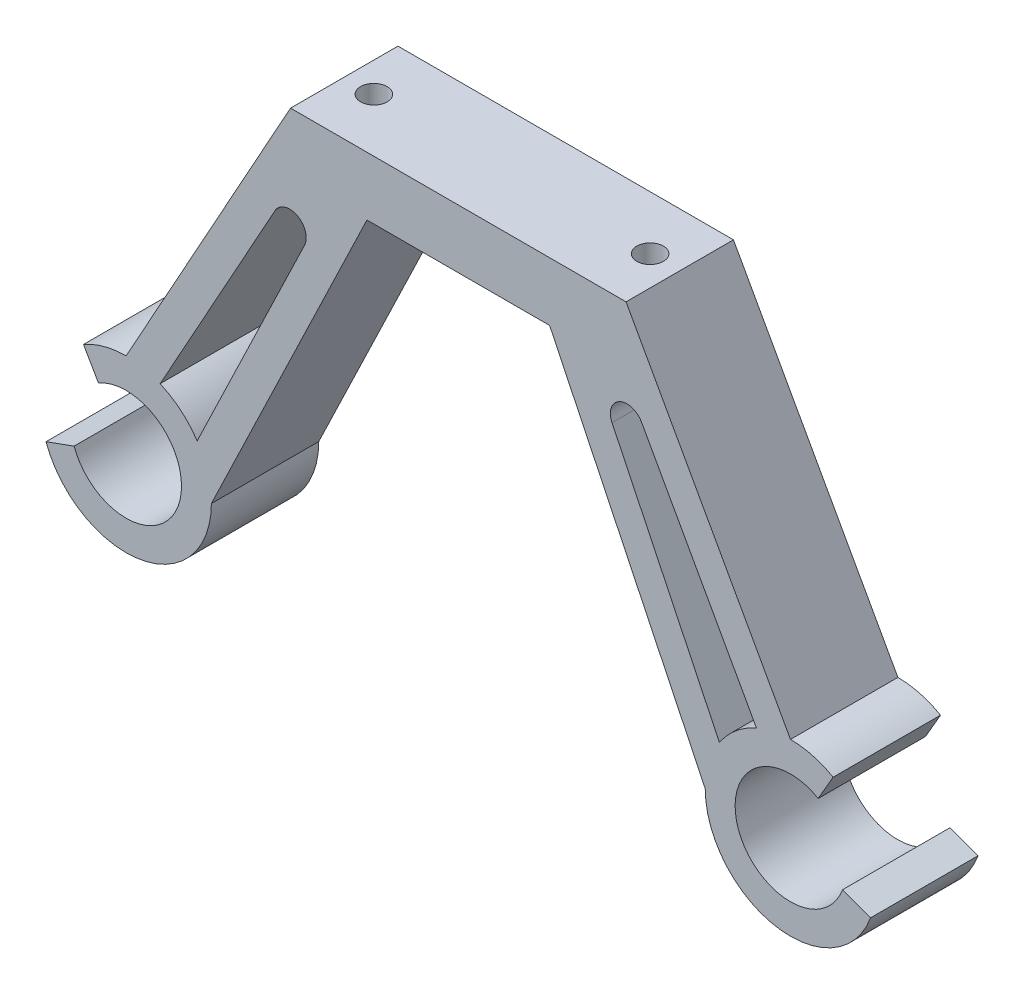
ISO-10303-21;
HEADER;
FILE_DESCRIPTION(('STEP AP214'),'2;1');
FILE_NAME('part.step','',(''),(''),'','','');
FILE_SCHEMA(('AUTOMOTIVE_DESIGN { 1 0 10303 214 1 1 1 1 }'));
ENDSEC;
DATA;
#1=APPLICATION_CONTEXT('core data for automotive mechanical design processes');
#2=APPLICATION_PROTOCOL_DEFINITION('international standard','automotive_design',2000,#1);
#3=PRODUCT_CONTEXT('',#1,'mechanical');
#4=PRODUCT('Part','Part','',(#3));
#5=PRODUCT_RELATED_PRODUCT_CATEGORY('part','',(#4));
#6=PRODUCT_DEFINITION_FORMATION('','',#4);
#7=PRODUCT_DEFINITION_CONTEXT('part definition',#1,'design');
#8=PRODUCT_DEFINITION('design','',#6,#7);
#9=PRODUCT_DEFINITION_SHAPE('','',#8);
#10=(LENGTH_UNIT() NAMED_UNIT(*) SI_UNIT(.MILLI.,.METRE.));
#11=(NAMED_UNIT(*) PLANE_ANGLE_UNIT() SI_UNIT($,.RADIAN.));
#12=(NAMED_UNIT(*) SI_UNIT($,.STERADIAN.) SOLID_ANGLE_UNIT());
#13=UNCERTAINTY_MEASURE_WITH_UNIT(LENGTH_MEASURE(1.E-05),#10,'distance_accuracy_value','');
#14=(GEOMETRIC_REPRESENTATION_CONTEXT(3) GLOBAL_UNCERTAINTY_ASSIGNED_CONTEXT((#13)) GLOBAL_UNIT_ASSIGNED_CONTEXT((#10,
#11,#12)) REPRESENTATION_CONTEXT('',''));
#15=CARTESIAN_POINT('',(0.,0.,0.));
#16=DIRECTION('',(0.,0.,1.));
#17=DIRECTION('',(1.,0.,0.));
#18=AXIS2_PLACEMENT_3D('',#15,#16,#17);
#19=CARTESIAN_POINT('',(-15.15,19.9,4.85));
#20=DIRECTION('',(0.874695571220269,-0.484672732560485,0.));
#21=DIRECTION('',(0.484672732560485,0.874695571220269,0.));
#22=AXIS2_PLACEMENT_3D('',#19,#20,#21);
#23=PLANE('',#22);
#24=DIRECTION('',(-0.484672732560485,-0.874695571220269,0.));
#25=VECTOR('',#24,1.);
#26=CARTESIAN_POINT('',(-15.15,19.9,-4.85));
#27=LINE('',#26,#25);
#28=CARTESIAN_POINT('',(-15.15,19.9,-4.85));
#29=VERTEX_POINT('',#28);
#30=CARTESIAN_POINT('',(-30.,-6.9,-4.85));
#31=VERTEX_POINT('',#30);
#32=EDGE_CURVE('E237',#29,#31,#27,.T.);
#33=ORIENTED_EDGE('',*,*,#32,.T.);
#34=DIRECTION('',(0.,0.,-1.));
#35=VECTOR('',#34,1.);
#36=CARTESIAN_POINT('',(-30.,-6.9,4.85));
#37=LINE('',#36,#35);
#38=CARTESIAN_POINT('',(-30.,-6.9,4.85));
#39=VERTEX_POINT('',#38);
#40=EDGE_CURVE('E11',#39,#31,#37,.T.);
#41=ORIENTED_EDGE('',*,*,#40,.F.);
#42=DIRECTION('',(-0.484672732560485,-0.874695571220269,0.));
#43=VECTOR('',#42,1.);
#44=CARTESIAN_POINT('',(-15.15,19.9,4.85));
#45=LINE('',#44,#43);
#46=CARTESIAN_POINT('',(-15.15,19.9,4.85));
#47=VERTEX_POINT('',#46);
#48=EDGE_CURVE('E271',#47,#39,#45,.T.);
#49=ORIENTED_EDGE('',*,*,#48,.F.);
#50=DIRECTION('',(0.,0.,-1.));
#51=VECTOR('',#50,1.);
#52=CARTESIAN_POINT('',(-15.15,19.9,4.85));
#53=LINE('',#52,#51);
#54=EDGE_CURVE('E305',#47,#29,#53,.T.);
#55=ORIENTED_EDGE('',*,*,#54,.T.);
#56=EDGE_LOOP('',(#33,#41,#49,#55));
#57=FACE_BOUND('',#56,.T.);
#58=ADVANCED_FACE('F39',(#57),#23,.F.);
#59=CARTESIAN_POINT('',(-30.,-14.6,4.85));
#60=DIRECTION('',(0.,0.,-1.));
#61=DIRECTION('',(-1.,0.,0.));
#62=AXIS2_PLACEMENT_3D('',#59,#60,#61);
#63=CYLINDRICAL_SURFACE('',#62,7.7);
#64=CARTESIAN_POINT('',(-30.,-14.6,-4.85));
#65=DIRECTION('',(0.,0.,1.));
#66=DIRECTION('',(1.,0.,0.));
#67=AXIS2_PLACEMENT_3D('',#64,#65,#66);
#68=CIRCLE('',#67,7.7);
#69=CARTESIAN_POINT('',(-33.85,-7.93160439085982,-4.85));
#70=VERTEX_POINT('',#69);
#71=EDGE_CURVE('E308',#31,#70,#68,.T.);
#72=ORIENTED_EDGE('',*,*,#71,.T.);
#73=DIRECTION('',(0.,0.,-1.));
#74=VECTOR('',#73,1.);
#75=CARTESIAN_POINT('',(-33.85,-7.93160439085982,4.85));
#76=LINE('',#75,#74);
#77=CARTESIAN_POINT('',(-33.85,-7.93160439085982,4.85));
#78=VERTEX_POINT('',#77);
#79=EDGE_CURVE('E46',#78,#70,#76,.T.);
#80=ORIENTED_EDGE('',*,*,#79,.F.);
#81=CARTESIAN_POINT('',(-30.,-14.6,4.85));
#82=DIRECTION('',(0.,0.,1.));
#83=DIRECTION('',(1.,0.,0.));
#84=AXIS2_PLACEMENT_3D('',#81,#82,#83);
#85=CIRCLE('',#84,7.7);
#86=EDGE_CURVE('E274',#39,#78,#85,.T.);
#87=ORIENTED_EDGE('',*,*,#86,.F.);
#88=ORIENTED_EDGE('',*,*,#40,.T.);
#89=EDGE_LOOP('',(#72,#80,#87,#88));
#90=FACE_BOUND('',#89,.T.);
#91=ADVANCED_FACE('F404',(#90),#63,.T.);
#92=CARTESIAN_POINT('',(-33.85,-7.93160439085982,4.85));
#93=DIRECTION('',(0.866025403784441,0.499999999999996,0.));
#94=DIRECTION('',(-0.499999999999996,0.866025403784441,0.));
#95=AXIS2_PLACEMENT_3D('',#92,#93,#94);
#96=PLANE('',#95);
#97=DIRECTION('',(0.499999999999996,-0.866025403784441,0.));
#98=VECTOR('',#97,1.);
#99=CARTESIAN_POINT('',(-33.85,-7.93160439085982,-4.85));
#100=LINE('',#99,#98);
#101=CARTESIAN_POINT('',(-32.5,-10.2698729810778,-4.85));
#102=VERTEX_POINT('',#101);
#103=EDGE_CURVE('E310',#70,#102,#100,.T.);
#104=ORIENTED_EDGE('',*,*,#103,.T.);
#105=DIRECTION('',(0.,0.,-1.));
#106=VECTOR('',#105,1.);
#107=CARTESIAN_POINT('',(-32.5,-10.2698729810778,4.85));
#108=LINE('',#107,#106);
#109=CARTESIAN_POINT('',(-32.5,-10.2698729810778,4.85));
#110=VERTEX_POINT('',#109);
#111=EDGE_CURVE('E375',#110,#102,#108,.T.);
#112=ORIENTED_EDGE('',*,*,#111,.F.);
#113=DIRECTION('',(0.499999999999996,-0.866025403784441,0.));
#114=VECTOR('',#113,1.);
#115=CARTESIAN_POINT('',(-33.85,-7.93160439085982,4.85));
#116=LINE('',#115,#114);
#117=EDGE_CURVE('E277',#78,#110,#116,.T.);
#118=ORIENTED_EDGE('',*,*,#117,.F.);
#119=ORIENTED_EDGE('',*,*,#79,.T.);
#120=EDGE_LOOP('',(#104,#112,#118,#119));
#121=FACE_BOUND('',#120,.T.);
#122=ADVANCED_FACE('F382',(#121),#96,.F.);
#123=CARTESIAN_POINT('',(-30.,-14.6,4.85));
#124=DIRECTION('',(0.,0.,-1.));
#125=DIRECTION('',(-1.,0.,0.));
#126=AXIS2_PLACEMENT_3D('',#123,#124,#125);
#127=CYLINDRICAL_SURFACE('',#126,5.);
#128=CARTESIAN_POINT('',(-30.,-14.6,-4.85));
#129=DIRECTION('',(0.,0.,-1.));
#130=DIRECTION('',(1.,0.,0.));
#131=AXIS2_PLACEMENT_3D('',#128,#129,#130);
#132=CIRCLE('',#131,5.);
#133=CARTESIAN_POINT('',(-34.6984631039295,-16.3101007166283,-4.85));
#134=VERTEX_POINT('',#133);
#135=EDGE_CURVE('E312',#102,#134,#132,.T.);
#136=ORIENTED_EDGE('',*,*,#135,.T.);
#137=DIRECTION('',(0.,0.,-1.));
#138=VECTOR('',#137,1.);
#139=CARTESIAN_POINT('',(-34.6984631039295,-16.3101007166283,4.85));
#140=LINE('',#139,#138);
#141=CARTESIAN_POINT('',(-34.6984631039295,-16.3101007166283,4.85));
#142=VERTEX_POINT('',#141);
#143=EDGE_CURVE('E372',#142,#134,#140,.T.);
#144=ORIENTED_EDGE('',*,*,#143,.F.);
#145=CARTESIAN_POINT('',(-30.,-14.6,4.85));
#146=DIRECTION('',(0.,0.,-1.));
#147=DIRECTION('',(1.,0.,0.));
#148=AXIS2_PLACEMENT_3D('',#145,#146,#147);
#149=CIRCLE('',#148,5.);
#150=EDGE_CURVE('E279',#110,#142,#149,.T.);
#151=ORIENTED_EDGE('',*,*,#150,.F.);
#152=ORIENTED_EDGE('',*,*,#111,.T.);
#153=EDGE_LOOP('',(#136,#144,#151,#152));
#154=FACE_BOUND('',#153,.T.);
#155=ADVANCED_FACE('F393',(#154),#127,.F.);
#156=CARTESIAN_POINT('',(-34.6984631039295,-16.3101007166283,4.85));
#157=DIRECTION('',(0.342020143325663,-0.93969262078591,0.));
#158=DIRECTION('',(0.939692620785911,0.342020143325663,0.));
#159=AXIS2_PLACEMENT_3D('',#156,#157,#158);
#160=PLANE('',#159);
#161=DIRECTION('',(-0.93969262078591,-0.342020143325663,0.));
#162=VECTOR('',#161,1.);
#163=CARTESIAN_POINT('',(-34.6984631039295,-16.3101007166283,-4.85));
#164=LINE('',#163,#162);
#165=CARTESIAN_POINT('',(-37.2356331800515,-17.2335551036076,-4.85));
#166=VERTEX_POINT('',#165);
#167=EDGE_CURVE('E314',#134,#166,#164,.T.);
#168=ORIENTED_EDGE('',*,*,#167,.T.);
#169=DIRECTION('',(0.,0.,-1.));
#170=VECTOR('',#169,1.);
#171=CARTESIAN_POINT('',(-37.2356331800515,-17.2335551036076,4.85));
#172=LINE('',#171,#170);
#173=CARTESIAN_POINT('',(-37.2356331800515,-17.2335551036076,4.85));
#174=VERTEX_POINT('',#173);
#175=EDGE_CURVE('E369',#174,#166,#172,.T.);
#176=ORIENTED_EDGE('',*,*,#175,.F.);
#177=DIRECTION('',(-0.93969262078591,-0.342020143325663,0.));
#178=VECTOR('',#177,1.);
#179=CARTESIAN_POINT('',(-34.6984631039295,-16.3101007166283,4.85));
#180=LINE('',#179,#178);
#181=EDGE_CURVE('E281',#142,#174,#180,.T.);
#182=ORIENTED_EDGE('',*,*,#181,.F.);
#183=ORIENTED_EDGE('',*,*,#143,.T.);
#184=EDGE_LOOP('',(#168,#176,#182,#183));
#185=FACE_BOUND('',#184,.T.);
#186=ADVANCED_FACE('F397',(#185),#160,.F.);
#187=CARTESIAN_POINT('',(-30.,-14.6,4.85));
#188=DIRECTION('',(0.,0.,-1.));
#189=DIRECTION('',(-1.,0.,0.));
#190=AXIS2_PLACEMENT_3D('',#187,#188,#189);
#191=CYLINDRICAL_SURFACE('',#190,7.7);
#192=CARTESIAN_POINT('',(-30.,-14.6,-4.85));
#193=DIRECTION('',(0.,0.,1.));
#194=DIRECTION('',(1.,0.,0.));
#195=AXIS2_PLACEMENT_3D('',#192,#193,#194);
#196=CIRCLE('',#195,7.7);
#197=CARTESIAN_POINT('',(-22.3,-14.6,-4.85));
#198=VERTEX_POINT('',#197);
#199=EDGE_CURVE('E316',#166,#198,#196,.T.);
#200=ORIENTED_EDGE('',*,*,#199,.T.);
#201=DIRECTION('',(0.,0.,-1.));
#202=VECTOR('',#201,1.);
#203=CARTESIAN_POINT('',(-22.3,-14.6,4.85));
#204=LINE('',#203,#202);
#205=CARTESIAN_POINT('',(-22.3,-14.6,4.85));
#206=VERTEX_POINT('',#205);
#207=EDGE_CURVE('E366',#206,#198,#204,.T.);
#208=ORIENTED_EDGE('',*,*,#207,.F.);
#209=CARTESIAN_POINT('',(-30.,-14.6,4.85));
#210=DIRECTION('',(0.,0.,1.));
#211=DIRECTION('',(1.,0.,0.));
#212=AXIS2_PLACEMENT_3D('',#209,#210,#211);
#213=CIRCLE('',#212,7.7);
#214=EDGE_CURVE('E283',#174,#206,#213,.T.);
#215=ORIENTED_EDGE('',*,*,#214,.F.);
#216=ORIENTED_EDGE('',*,*,#175,.T.);
#217=EDGE_LOOP('',(#200,#208,#215,#216));
#218=FACE_BOUND('',#217,.T.);
#219=ADVANCED_FACE('F457',(#218),#191,.T.);
#220=CARTESIAN_POINT('',(-22.3,-14.6,4.85));
#221=DIRECTION('',(-0.901113327145817,0.433583638575299,0.));
#222=DIRECTION('',(-0.433583638575299,-0.901113327145817,0.));
#223=AXIS2_PLACEMENT_3D('',#220,#221,#222);
#224=PLANE('',#223);
#225=DIRECTION('',(0.433583638575299,0.901113327145817,0.));
#226=VECTOR('',#225,1.);
#227=CARTESIAN_POINT('',(-22.3,-14.6,-4.85));
#228=LINE('',#227,#226);
#229=CARTESIAN_POINT('',(-8.25,14.6,-4.85));
#230=VERTEX_POINT('',#229);
#231=EDGE_CURVE('E318',#198,#230,#228,.T.);
#232=ORIENTED_EDGE('',*,*,#231,.T.);
#233=DIRECTION('',(0.,0.,-1.));
#234=VECTOR('',#233,1.);
#235=CARTESIAN_POINT('',(-8.25,14.6,4.85));
#236=LINE('',#235,#234);
#237=CARTESIAN_POINT('',(-8.25,14.6,4.85));
#238=VERTEX_POINT('',#237);
#239=EDGE_CURVE('E363',#238,#230,#236,.T.);
#240=ORIENTED_EDGE('',*,*,#239,.F.);
#241=DIRECTION('',(0.433583638575299,0.901113327145817,0.));
#242=VECTOR('',#241,1.);
#243=CARTESIAN_POINT('',(-22.3,-14.6,4.85));
#244=LINE('',#243,#242);
#245=EDGE_CURVE('E285',#206,#238,#244,.T.);
#246=ORIENTED_EDGE('',*,*,#245,.F.);
#247=ORIENTED_EDGE('',*,*,#207,.T.);
#248=EDGE_LOOP('',(#232,#240,#246,#247));
#249=FACE_BOUND('',#248,.T.);
#250=ADVANCED_FACE('F454',(#249),#224,.F.);
#251=CARTESIAN_POINT('',(-8.25,14.6,4.85));
#252=DIRECTION('',(0.,1.,0.));
#253=DIRECTION('',(0.,0.,1.));
#254=AXIS2_PLACEMENT_3D('',#251,#252,#253);
#255=PLANE('',#254);
#256=DIRECTION('',(1.,0.,0.));
#257=VECTOR('',#256,1.);
#258=CARTESIAN_POINT('',(-8.25,14.6,-4.85));
#259=LINE('',#258,#257);
#260=CARTESIAN_POINT('',(8.25,14.6,-4.85));
#261=VERTEX_POINT('',#260);
#262=EDGE_CURVE('E320',#230,#261,#259,.T.);
#263=ORIENTED_EDGE('',*,*,#262,.T.);
#264=DIRECTION('',(0.,0.,-1.));
#265=VECTOR('',#264,1.);
#266=CARTESIAN_POINT('',(8.25,14.6,4.85));
#267=LINE('',#266,#265);
#268=CARTESIAN_POINT('',(8.25,14.6,4.85));
#269=VERTEX_POINT('',#268);
#270=EDGE_CURVE('E360',#269,#261,#267,.T.);
#271=ORIENTED_EDGE('',*,*,#270,.F.);
#272=DIRECTION('',(1.,0.,0.));
#273=VECTOR('',#272,1.);
#274=CARTESIAN_POINT('',(-8.25,14.6,4.85));
#275=LINE('',#274,#273);
#276=EDGE_CURVE('E287',#238,#269,#275,.T.);
#277=ORIENTED_EDGE('',*,*,#276,.F.);
#278=ORIENTED_EDGE('',*,*,#239,.T.);
#279=EDGE_LOOP('',(#263,#271,#277,#278));
#280=FACE_BOUND('',#279,.T.);
#281=ADVANCED_FACE('F450',(#280),#255,.F.);
#282=CARTESIAN_POINT('',(8.25,14.6,4.85));
#283=DIRECTION('',(0.901113327145817,0.433583638575299,0.));
#284=DIRECTION('',(-0.433583638575299,0.901113327145817,0.));
#285=AXIS2_PLACEMENT_3D('',#282,#283,#284);
#286=PLANE('',#285);
#287=DIRECTION('',(0.433583638575299,-0.901113327145817,0.));
#288=VECTOR('',#287,1.);
#289=CARTESIAN_POINT('',(8.25,14.6,-4.85));
#290=LINE('',#289,#288);
#291=CARTESIAN_POINT('',(22.3,-14.6,-4.85));
#292=VERTEX_POINT('',#291);
#293=EDGE_CURVE('E322',#261,#292,#290,.T.);
#294=ORIENTED_EDGE('',*,*,#293,.T.);
#295=DIRECTION('',(0.,0.,-1.));
#296=VECTOR('',#295,1.);
#297=CARTESIAN_POINT('',(22.3,-14.6,4.85));
#298=LINE('',#297,#296);
#299=CARTESIAN_POINT('',(22.3,-14.6,4.85));
#300=VERTEX_POINT('',#299);
#301=EDGE_CURVE('E357',#300,#292,#298,.T.);
#302=ORIENTED_EDGE('',*,*,#301,.F.);
#303=DIRECTION('',(0.433583638575299,-0.901113327145817,0.));
#304=VECTOR('',#303,1.);
#305=CARTESIAN_POINT('',(8.25,14.6,4.85));
#306=LINE('',#305,#304);
#307=EDGE_CURVE('E289',#269,#300,#306,.T.);
#308=ORIENTED_EDGE('',*,*,#307,.F.);
#309=ORIENTED_EDGE('',*,*,#270,.T.);
#310=EDGE_LOOP('',(#294,#302,#308,#309));
#311=FACE_BOUND('',#310,.T.);
#312=ADVANCED_FACE('F446',(#311),#286,.F.);
#313=CARTESIAN_POINT('',(30.,-14.6,4.85));
#314=DIRECTION('',(0.,0.,-1.));
#315=DIRECTION('',(-1.,0.,0.));
#316=AXIS2_PLACEMENT_3D('',#313,#314,#315);
#317=CYLINDRICAL_SURFACE('',#316,7.7);
#318=CARTESIAN_POINT('',(30.,-14.6,-4.85));
#319=DIRECTION('',(0.,0.,1.));
#320=DIRECTION('',(1.,0.,0.));
#321=AXIS2_PLACEMENT_3D('',#318,#319,#320);
#322=CIRCLE('',#321,7.7);
#323=CARTESIAN_POINT('',(37.2356331800515,-17.2335551036076,-4.85));
#324=VERTEX_POINT('',#323);
#325=EDGE_CURVE('E324',#292,#324,#322,.T.);
#326=ORIENTED_EDGE('',*,*,#325,.T.);
#327=DIRECTION('',(0.,0.,-1.));
#328=VECTOR('',#327,1.);
#329=CARTESIAN_POINT('',(37.2356331800515,-17.2335551036076,4.85));
#330=LINE('',#329,#328);
#331=CARTESIAN_POINT('',(37.2356331800515,-17.2335551036076,4.85));
#332=VERTEX_POINT('',#331);
#333=EDGE_CURVE('E354',#332,#324,#330,.T.);
#334=ORIENTED_EDGE('',*,*,#333,.F.);
#335=CARTESIAN_POINT('',(30.,-14.6,4.85));
#336=DIRECTION('',(0.,0.,1.));
#337=DIRECTION('',(1.,0.,0.));
#338=AXIS2_PLACEMENT_3D('',#335,#336,#337);
#339=CIRCLE('',#338,7.7);
#340=EDGE_CURVE('E291',#300,#332,#339,.T.);
#341=ORIENTED_EDGE('',*,*,#340,.F.);
#342=ORIENTED_EDGE('',*,*,#301,.T.);
#343=EDGE_LOOP('',(#326,#334,#341,#342));
#344=FACE_BOUND('',#343,.T.);
#345=ADVANCED_FACE('F441',(#344),#317,.T.);
#346=CARTESIAN_POINT('',(34.6984631039295,-16.3101007166283,4.85));
#347=DIRECTION('',(-0.342020143325663,-0.93969262078591,0.));
#348=DIRECTION('',(0.939692620785911,-0.342020143325663,0.));
#349=AXIS2_PLACEMENT_3D('',#346,#347,#348);
#350=PLANE('',#349);
#351=DIRECTION('',(-0.93969262078591,0.342020143325663,0.));
#352=VECTOR('',#351,1.);
#353=CARTESIAN_POINT('',(34.6984631039295,-16.3101007166283,-4.85));
#354=LINE('',#353,#352);
#355=CARTESIAN_POINT('',(34.6984631039295,-16.3101007166283,-4.85));
#356=VERTEX_POINT('',#355);
#357=EDGE_CURVE('E326',#324,#356,#354,.T.);
#358=ORIENTED_EDGE('',*,*,#357,.T.);
#359=DIRECTION('',(0.,0.,-1.));
#360=VECTOR('',#359,1.);
#361=CARTESIAN_POINT('',(34.6984631039295,-16.3101007166283,4.85));
#362=LINE('',#361,#360);
#363=CARTESIAN_POINT('',(34.6984631039295,-16.3101007166283,4.85));
#364=VERTEX_POINT('',#363);
#365=EDGE_CURVE('E351',#364,#356,#362,.T.);
#366=ORIENTED_EDGE('',*,*,#365,.F.);
#367=DIRECTION('',(-0.93969262078591,0.342020143325663,0.));
#368=VECTOR('',#367,1.);
#369=CARTESIAN_POINT('',(34.6984631039295,-16.3101007166283,4.85));
#370=LINE('',#369,#368);
#371=EDGE_CURVE('E293',#332,#364,#370,.T.);
#372=ORIENTED_EDGE('',*,*,#371,.F.);
#373=ORIENTED_EDGE('',*,*,#333,.T.);
#374=EDGE_LOOP('',(#358,#366,#372,#373));
#375=FACE_BOUND('',#374,.T.);
#376=ADVANCED_FACE('F435',(#375),#350,.F.);
#377=CARTESIAN_POINT('',(30.,-14.6,4.85));
#378=DIRECTION('',(0.,0.,-1.));
#379=DIRECTION('',(-1.,0.,0.));
#380=AXIS2_PLACEMENT_3D('',#377,#378,#379);
#381=CYLINDRICAL_SURFACE('',#380,5.);
#382=CARTESIAN_POINT('',(30.,-14.6,-4.85));
#383=DIRECTION('',(0.,0.,-1.));
#384=DIRECTION('',(1.,0.,0.));
#385=AXIS2_PLACEMENT_3D('',#382,#383,#384);
#386=CIRCLE('',#385,5.);
#387=CARTESIAN_POINT('',(32.5,-10.2698729810778,-4.85));
#388=VERTEX_POINT('',#387);
#389=EDGE_CURVE('E328',#356,#388,#386,.T.);
#390=ORIENTED_EDGE('',*,*,#389,.T.);
#391=DIRECTION('',(0.,0.,-1.));
#392=VECTOR('',#391,1.);
#393=CARTESIAN_POINT('',(32.5,-10.2698729810778,4.85));
#394=LINE('',#393,#392);
#395=CARTESIAN_POINT('',(32.5,-10.2698729810778,4.85));
#396=VERTEX_POINT('',#395);
#397=EDGE_CURVE('E348',#396,#388,#394,.T.);
#398=ORIENTED_EDGE('',*,*,#397,.F.);
#399=CARTESIAN_POINT('',(30.,-14.6,4.85));
#400=DIRECTION('',(0.,0.,-1.));
#401=DIRECTION('',(1.,0.,0.));
#402=AXIS2_PLACEMENT_3D('',#399,#400,#401);
#403=CIRCLE('',#402,5.);
#404=EDGE_CURVE('E295',#364,#396,#403,.T.);
#405=ORIENTED_EDGE('',*,*,#404,.F.);
#406=ORIENTED_EDGE('',*,*,#365,.T.);
#407=EDGE_LOOP('',(#390,#398,#405,#406));
#408=FACE_BOUND('',#407,.T.);
#409=ADVANCED_FACE('F431',(#408),#381,.F.);
#410=CARTESIAN_POINT('',(33.85,-7.93160439085982,4.85));
#411=DIRECTION('',(-0.866025403784441,0.499999999999996,0.));
#412=DIRECTION('',(-0.499999999999996,-0.866025403784441,0.));
#413=AXIS2_PLACEMENT_3D('',#410,#411,#412);
#414=PLANE('',#413);
#415=DIRECTION('',(0.499999999999996,0.866025403784441,0.));
#416=VECTOR('',#415,1.);
#417=CARTESIAN_POINT('',(33.85,-7.93160439085982,-4.85));
#418=LINE('',#417,#416);
#419=CARTESIAN_POINT('',(33.85,-7.93160439085982,-4.85));
#420=VERTEX_POINT('',#419);
#421=EDGE_CURVE('E330',#388,#420,#418,.T.);
#422=ORIENTED_EDGE('',*,*,#421,.T.);
#423=DIRECTION('',(0.,0.,-1.));
#424=VECTOR('',#423,1.);
#425=CARTESIAN_POINT('',(33.85,-7.93160439085982,4.85));
#426=LINE('',#425,#424);
#427=CARTESIAN_POINT('',(33.85,-7.93160439085982,4.85));
#428=VERTEX_POINT('',#427);
#429=EDGE_CURVE('E345',#428,#420,#426,.T.);
#430=ORIENTED_EDGE('',*,*,#429,.F.);
#431=DIRECTION('',(0.499999999999996,0.866025403784441,0.));
#432=VECTOR('',#431,1.);
#433=CARTESIAN_POINT('',(33.85,-7.93160439085982,4.85));
#434=LINE('',#433,#432);
#435=EDGE_CURVE('E297',#396,#428,#434,.T.);
#436=ORIENTED_EDGE('',*,*,#435,.F.);
#437=ORIENTED_EDGE('',*,*,#397,.T.);
#438=EDGE_LOOP('',(#422,#430,#436,#437));
#439=FACE_BOUND('',#438,.T.);
#440=ADVANCED_FACE('F426',(#439),#414,.F.);
#441=CARTESIAN_POINT('',(30.,-14.6,4.85));
#442=DIRECTION('',(0.,0.,-1.));
#443=DIRECTION('',(-1.,0.,0.));
#444=AXIS2_PLACEMENT_3D('',#441,#442,#443);
#445=CYLINDRICAL_SURFACE('',#444,7.7);
#446=CARTESIAN_POINT('',(30.,-14.6,-4.85));
#447=DIRECTION('',(0.,0.,1.));
#448=DIRECTION('',(1.,0.,0.));
#449=AXIS2_PLACEMENT_3D('',#446,#447,#448);
#450=CIRCLE('',#449,7.7);
#451=CARTESIAN_POINT('',(30.,-6.9,-4.85));
#452=VERTEX_POINT('',#451);
#453=EDGE_CURVE('E332',#420,#452,#450,.T.);
#454=ORIENTED_EDGE('',*,*,#453,.T.);
#455=DIRECTION('',(0.,0.,-1.));
#456=VECTOR('',#455,1.);
#457=CARTESIAN_POINT('',(30.,-6.9,4.85));
#458=LINE('',#457,#456);
#459=CARTESIAN_POINT('',(30.,-6.9,4.85));
#460=VERTEX_POINT('',#459);
#461=EDGE_CURVE('E342',#460,#452,#458,.T.);
#462=ORIENTED_EDGE('',*,*,#461,.F.);
#463=CARTESIAN_POINT('',(30.,-14.6,4.85));
#464=DIRECTION('',(0.,0.,1.));
#465=DIRECTION('',(1.,0.,0.));
#466=AXIS2_PLACEMENT_3D('',#463,#464,#465);
#467=CIRCLE('',#466,7.7);
#468=EDGE_CURVE('E299',#428,#460,#467,.T.);
#469=ORIENTED_EDGE('',*,*,#468,.F.);
#470=ORIENTED_EDGE('',*,*,#429,.T.);
#471=EDGE_LOOP('',(#454,#462,#469,#470));
#472=FACE_BOUND('',#471,.T.);
#473=ADVANCED_FACE('F420',(#472),#445,.T.);
#474=CARTESIAN_POINT('',(15.15,19.9,4.85));
#475=DIRECTION('',(-0.874695571220269,-0.484672732560485,0.));
#476=DIRECTION('',(0.484672732560485,-0.874695571220269,0.));
#477=AXIS2_PLACEMENT_3D('',#474,#475,#476);
#478=PLANE('',#477);
#479=DIRECTION('',(-0.484672732560485,0.874695571220269,0.));
#480=VECTOR('',#479,1.);
#481=CARTESIAN_POINT('',(15.15,19.9,-4.85));
#482=LINE('',#481,#480);
#483=CARTESIAN_POINT('',(15.15,19.9,-4.85));
#484=VERTEX_POINT('',#483);
#485=EDGE_CURVE('E334',#452,#484,#482,.T.);
#486=ORIENTED_EDGE('',*,*,#485,.T.);
#487=DIRECTION('',(0.,0.,-1.));
#488=VECTOR('',#487,1.);
#489=CARTESIAN_POINT('',(15.15,19.9,4.85));
#490=LINE('',#489,#488);
#491=CARTESIAN_POINT('',(15.15,19.9,4.85));
#492=VERTEX_POINT('',#491);
#493=EDGE_CURVE('E339',#492,#484,#490,.T.);
#494=ORIENTED_EDGE('',*,*,#493,.F.);
#495=DIRECTION('',(-0.484672732560485,0.874695571220269,0.));
#496=VECTOR('',#495,1.);
#497=CARTESIAN_POINT('',(15.15,19.9,4.85));
#498=LINE('',#497,#496);
#499=EDGE_CURVE('E301',#460,#492,#498,.T.);
#500=ORIENTED_EDGE('',*,*,#499,.F.);
#501=ORIENTED_EDGE('',*,*,#461,.T.);
#502=EDGE_LOOP('',(#486,#494,#500,#501));
#503=FACE_BOUND('',#502,.T.);
#504=ADVANCED_FACE('F416',(#503),#478,.F.);
#505=CARTESIAN_POINT('',(-15.15,19.9,4.85));
#506=DIRECTION('',(0.,-1.,0.));
#507=DIRECTION('',(0.,0.,-1.));
#508=AXIS2_PLACEMENT_3D('',#505,#506,#507);
#509=PLANE('',#508);
#510=CARTESIAN_POINT('',(-12.475,19.9,0.));
#511=DIRECTION('',(0.,1.,0.));
#512=DIRECTION('',(0.,0.,1.));
#513=AXIS2_PLACEMENT_3D('',#510,#511,#512);
#514=CIRCLE('',#513,1.2);
#515=CARTESIAN_POINT('',(-12.475,19.9,1.2));
#516=VERTEX_POINT('',#515);
#517=EDGE_CURVE('E652',#516,#516,#514,.T.);
#518=ORIENTED_EDGE('',*,*,#517,.F.);
#519=EDGE_LOOP('',(#518));
#520=FACE_BOUND('',#519,.T.);
#521=CARTESIAN_POINT('',(12.475,19.9,0.));
#522=DIRECTION('',(0.,1.,0.));
#523=DIRECTION('',(0.,0.,1.));
#524=AXIS2_PLACEMENT_3D('',#521,#522,#523);
#525=CIRCLE('',#524,1.2);
#526=CARTESIAN_POINT('',(12.475,19.9,1.2));
#527=VERTEX_POINT('',#526);
#528=EDGE_CURVE('E660',#527,#527,#525,.T.);
#529=ORIENTED_EDGE('',*,*,#528,.F.);
#530=EDGE_LOOP('',(#529));
#531=FACE_BOUND('',#530,.T.);
#532=DIRECTION('',(-1.,0.,0.));
#533=VECTOR('',#532,1.);
#534=CARTESIAN_POINT('',(-15.15,19.9,-4.85));
#535=LINE('',#534,#533);
#536=EDGE_CURVE('E275',#484,#29,#535,.T.);
#537=ORIENTED_EDGE('',*,*,#536,.T.);
#538=ORIENTED_EDGE('',*,*,#54,.F.);
#539=DIRECTION('',(-1.,0.,0.));
#540=VECTOR('',#539,1.);
#541=CARTESIAN_POINT('',(-15.15,19.9,4.85));
#542=LINE('',#541,#540);
#543=EDGE_CURVE('E303',#492,#47,#542,.T.);
#544=ORIENTED_EDGE('',*,*,#543,.F.);
#545=ORIENTED_EDGE('',*,*,#493,.T.);
#546=EDGE_LOOP('',(#537,#538,#544,#545));
#547=FACE_BOUND('',#546,.T.);
#548=ADVANCED_FACE('F411',(#520,#531,#547),#509,.F.);
#549=CARTESIAN_POINT('',(-30.,-14.6,4.85));
#550=DIRECTION('',(0.,0.,1.));
#551=DIRECTION('',(1.,0.,0.));
#552=AXIS2_PLACEMENT_3D('',#549,#550,#551);
#553=PLANE('',#552);
#554=CARTESIAN_POINT('',(-15.2341531707299,10.4635120391865,4.85));
#555=DIRECTION('',(0.,0.,1.));
#556=DIRECTION('',(1.,0.,0.));
#557=AXIS2_PLACEMENT_3D('',#554,#555,#556);
#558=CIRCLE('',#557,1.5);
#559=CARTESIAN_POINT('',(-13.8824831800112,9.81313658132356,4.85));
#560=VERTEX_POINT('',#559);
#561=CARTESIAN_POINT('',(-16.5461965275603,11.1905211380272,4.85));
#562=VERTEX_POINT('',#561);
#563=EDGE_CURVE('E53',#560,#562,#558,.T.);
#564=ORIENTED_EDGE('',*,*,#563,.F.);
#565=DIRECTION('',(0.433583638575299,0.901113327145817,0.));
#566=VECTOR('',#565,1.);
#567=CARTESIAN_POINT('',(-13.8824831800112,9.81313658132356,4.85));
#568=LINE('',#567,#566);
#569=CARTESIAN_POINT('',(-23.5821075537111,-10.3455133625938,4.85));
#570=VERTEX_POINT('',#569);
#571=EDGE_CURVE('E221',#570,#560,#568,.T.);
#572=ORIENTED_EDGE('',*,*,#571,.F.);
#573=CARTESIAN_POINT('',(-30.,-14.6,4.85));
#574=DIRECTION('',(0.,0.,-1.));
#575=DIRECTION('',(1.,0.,0.));
#576=AXIS2_PLACEMENT_3D('',#573,#574,#575);
#577=CIRCLE('',#576,7.7);
#578=CARTESIAN_POINT('',(-26.9251805987225,-7.54057469410382,4.85));
#579=VERTEX_POINT('',#578);
#580=EDGE_CURVE('E203',#579,#570,#577,.T.);
#581=ORIENTED_EDGE('',*,*,#580,.F.);
#582=DIRECTION('',(-0.484672732560485,-0.874695571220269,0.));
#583=VECTOR('',#582,1.);
#584=CARTESIAN_POINT('',(-26.9251805987225,-7.54057469410382,4.85));
#585=LINE('',#584,#583);
#586=EDGE_CURVE('E214',#562,#579,#585,.T.);
#587=ORIENTED_EDGE('',*,*,#586,.F.);
#588=EDGE_LOOP('',(#564,#572,#581,#587));
#589=FACE_BOUND('',#588,.T.);
#590=CARTESIAN_POINT('',(15.2341531707299,10.4635120391865,4.85));
#591=DIRECTION('',(0.,0.,1.));
#592=DIRECTION('',(-1.,0.,0.));
#593=AXIS2_PLACEMENT_3D('',#590,#591,#592);
#594=CIRCLE('',#593,1.5);
#595=CARTESIAN_POINT('',(16.5461965275603,11.1905211380272,4.85));
#596=VERTEX_POINT('',#595);
#597=CARTESIAN_POINT('',(13.8824831800112,9.81313658132356,4.85));
#598=VERTEX_POINT('',#597);
#599=EDGE_CURVE('E61',#596,#598,#594,.T.);
#600=ORIENTED_EDGE('',*,*,#599,.F.);
#601=DIRECTION('',(-0.484672732560485,0.874695571220269,0.));
#602=VECTOR('',#601,1.);
#603=CARTESIAN_POINT('',(26.9251805987225,-7.54057469410382,4.85));
#604=LINE('',#603,#602);
#605=CARTESIAN_POINT('',(26.9251805987225,-7.54057469410382,4.85));
#606=VERTEX_POINT('',#605);
#607=EDGE_CURVE('E248',#606,#596,#604,.T.);
#608=ORIENTED_EDGE('',*,*,#607,.F.);
#609=CARTESIAN_POINT('',(30.,-14.6,4.85));
#610=DIRECTION('',(0.,0.,-1.));
#611=DIRECTION('',(-1.,0.,0.));
#612=AXIS2_PLACEMENT_3D('',#609,#610,#611);
#613=CIRCLE('',#612,7.7);
#614=CARTESIAN_POINT('',(23.5821075537111,-10.3455133625938,4.85));
#615=VERTEX_POINT('',#614);
#616=EDGE_CURVE('E245',#615,#606,#613,.T.);
#617=ORIENTED_EDGE('',*,*,#616,.F.);
#618=DIRECTION('',(0.433583638575299,-0.901113327145817,0.));
#619=VECTOR('',#618,1.);
#620=CARTESIAN_POINT('',(13.8824831800112,9.81313658132356,4.85));
#621=LINE('',#620,#619);
#622=EDGE_CURVE('E241',#598,#615,#621,.T.);
#623=ORIENTED_EDGE('',*,*,#622,.F.);
#624=EDGE_LOOP('',(#600,#608,#617,#623));
#625=FACE_BOUND('',#624,.T.);
#626=ORIENTED_EDGE('',*,*,#48,.T.);
#627=ORIENTED_EDGE('',*,*,#86,.T.);
#628=ORIENTED_EDGE('',*,*,#117,.T.);
#629=ORIENTED_EDGE('',*,*,#150,.T.);
#630=ORIENTED_EDGE('',*,*,#181,.T.);
#631=ORIENTED_EDGE('',*,*,#214,.T.);
#632=ORIENTED_EDGE('',*,*,#245,.T.);
#633=ORIENTED_EDGE('',*,*,#276,.T.);
#634=ORIENTED_EDGE('',*,*,#307,.T.);
#635=ORIENTED_EDGE('',*,*,#340,.T.);
#636=ORIENTED_EDGE('',*,*,#371,.T.);
#637=ORIENTED_EDGE('',*,*,#404,.T.);
#638=ORIENTED_EDGE('',*,*,#435,.T.);
#639=ORIENTED_EDGE('',*,*,#468,.T.);
#640=ORIENTED_EDGE('',*,*,#499,.T.);
#641=ORIENTED_EDGE('',*,*,#543,.T.);
#642=EDGE_LOOP('',(#626,#627,#628,#629,#630,#631,#632,#633,#634,#635,#636,#637,#638,#639,#640,#641));
#643=FACE_BOUND('',#642,.T.);
#644=ADVANCED_FACE('F218',(#589,#625,#643),#553,.T.);
#645=CARTESIAN_POINT('',(-30.,-14.6,-4.85));
#646=DIRECTION('',(0.,0.,1.));
#647=DIRECTION('',(1.,0.,0.));
#648=AXIS2_PLACEMENT_3D('',#645,#646,#647);
#649=PLANE('',#648);
#650=DIRECTION('',(0.433583638575299,0.901113327145817,0.));
#651=VECTOR('',#650,1.);
#652=CARTESIAN_POINT('',(-13.8824831800112,9.81313658132356,-4.85));
#653=LINE('',#652,#651);
#654=CARTESIAN_POINT('',(-23.5821075537111,-10.3455133625938,-4.85));
#655=VERTEX_POINT('',#654);
#656=CARTESIAN_POINT('',(-13.8824831800112,9.81313658132356,-4.85));
#657=VERTEX_POINT('',#656);
#658=EDGE_CURVE('E232',#655,#657,#653,.T.);
#659=ORIENTED_EDGE('',*,*,#658,.T.);
#660=CARTESIAN_POINT('',(-15.2341531707299,10.4635120391865,-4.85));
#661=DIRECTION('',(0.,0.,1.));
#662=DIRECTION('',(1.,0.,0.));
#663=AXIS2_PLACEMENT_3D('',#660,#661,#662);
#664=CIRCLE('',#663,1.5);
#665=CARTESIAN_POINT('',(-16.5461965275603,11.1905211380272,-4.85));
#666=VERTEX_POINT('',#665);
#667=EDGE_CURVE('E223',#657,#666,#664,.T.);
#668=ORIENTED_EDGE('',*,*,#667,.T.);
#669=DIRECTION('',(-0.484672732560485,-0.874695571220269,0.));
#670=VECTOR('',#669,1.);
#671=CARTESIAN_POINT('',(-26.9251805987225,-7.54057469410382,-4.85));
#672=LINE('',#671,#670);
#673=CARTESIAN_POINT('',(-26.9251805987225,-7.54057469410382,-4.85));
#674=VERTEX_POINT('',#673);
#675=EDGE_CURVE('E229',#666,#674,#672,.T.);
#676=ORIENTED_EDGE('',*,*,#675,.T.);
#677=CARTESIAN_POINT('',(-30.,-14.6,-4.85));
#678=DIRECTION('',(0.,0.,-1.));
#679=DIRECTION('',(1.,0.,0.));
#680=AXIS2_PLACEMENT_3D('',#677,#678,#679);
#681=CIRCLE('',#680,7.7);
#682=EDGE_CURVE('E206',#674,#655,#681,.T.);
#683=ORIENTED_EDGE('',*,*,#682,.T.);
#684=EDGE_LOOP('',(#659,#668,#676,#683));
#685=FACE_BOUND('',#684,.T.);
#686=DIRECTION('',(-0.484672732560485,0.874695571220269,0.));
#687=VECTOR('',#686,1.);
#688=CARTESIAN_POINT('',(26.9251805987225,-7.54057469410382,-4.85));
#689=LINE('',#688,#687);
#690=CARTESIAN_POINT('',(26.9251805987225,-7.54057469410382,-4.85));
#691=VERTEX_POINT('',#690);
#692=CARTESIAN_POINT('',(16.5461965275603,11.1905211380272,-4.85));
#693=VERTEX_POINT('',#692);
#694=EDGE_CURVE('E260',#691,#693,#689,.T.);
#695=ORIENTED_EDGE('',*,*,#694,.T.);
#696=CARTESIAN_POINT('',(15.2341531707299,10.4635120391865,-4.85));
#697=DIRECTION('',(0.,0.,1.));
#698=DIRECTION('',(-1.,0.,0.));
#699=AXIS2_PLACEMENT_3D('',#696,#697,#698);
#700=CIRCLE('',#699,1.5);
#701=CARTESIAN_POINT('',(13.8824831800112,9.81313658132356,-4.85));
#702=VERTEX_POINT('',#701);
#703=EDGE_CURVE('E251',#693,#702,#700,.T.);
#704=ORIENTED_EDGE('',*,*,#703,.T.);
#705=DIRECTION('',(0.433583638575299,-0.901113327145817,0.));
#706=VECTOR('',#705,1.);
#707=CARTESIAN_POINT('',(13.8824831800112,9.81313658132356,-4.85));
#708=LINE('',#707,#706);
#709=CARTESIAN_POINT('',(23.5821075537111,-10.3455133625938,-4.85));
#710=VERTEX_POINT('',#709);
#711=EDGE_CURVE('E254',#702,#710,#708,.T.);
#712=ORIENTED_EDGE('',*,*,#711,.T.);
#713=CARTESIAN_POINT('',(30.,-14.6,-4.85));
#714=DIRECTION('',(0.,0.,-1.));
#715=DIRECTION('',(-1.,0.,0.));
#716=AXIS2_PLACEMENT_3D('',#713,#714,#715);
#717=CIRCLE('',#716,7.7);
#718=EDGE_CURVE('E257',#710,#691,#717,.T.);
#719=ORIENTED_EDGE('',*,*,#718,.T.);
#720=EDGE_LOOP('',(#695,#704,#712,#719));
#721=FACE_BOUND('',#720,.T.);
#722=ORIENTED_EDGE('',*,*,#32,.F.);
#723=ORIENTED_EDGE('',*,*,#536,.F.);
#724=ORIENTED_EDGE('',*,*,#485,.F.);
#725=ORIENTED_EDGE('',*,*,#453,.F.);
#726=ORIENTED_EDGE('',*,*,#421,.F.);
#727=ORIENTED_EDGE('',*,*,#389,.F.);
#728=ORIENTED_EDGE('',*,*,#357,.F.);
#729=ORIENTED_EDGE('',*,*,#325,.F.);
#730=ORIENTED_EDGE('',*,*,#293,.F.);
#731=ORIENTED_EDGE('',*,*,#262,.F.);
#732=ORIENTED_EDGE('',*,*,#231,.F.);
#733=ORIENTED_EDGE('',*,*,#199,.F.);
#734=ORIENTED_EDGE('',*,*,#167,.F.);
#735=ORIENTED_EDGE('',*,*,#135,.F.);
#736=ORIENTED_EDGE('',*,*,#103,.F.);
#737=ORIENTED_EDGE('',*,*,#71,.F.);
#738=EDGE_LOOP('',(#722,#723,#724,#725,#726,#727,#728,#729,#730,#731,#732,#733,#734,#735,#736,#737));
#739=FACE_BOUND('',#738,.T.);
#740=ADVANCED_FACE('F388',(#685,#721,#739),#649,.F.);
#741=CARTESIAN_POINT('',(15.2341531707299,10.4635120391865,-4.85));
#742=DIRECTION('',(0.,0.,1.));
#743=DIRECTION('',(1.,0.,0.));
#744=AXIS2_PLACEMENT_3D('',#741,#742,#743);
#745=CYLINDRICAL_SURFACE('',#744,1.5);
#746=DIRECTION('',(0.,0.,1.));
#747=VECTOR('',#746,1.);
#748=CARTESIAN_POINT('',(13.8824831800112,9.81313658132356,-4.85));
#749=LINE('',#748,#747);
#750=EDGE_CURVE('E263',#702,#598,#749,.T.);
#751=ORIENTED_EDGE('',*,*,#750,.F.);
#752=ORIENTED_EDGE('',*,*,#703,.F.);
#753=DIRECTION('',(0.,0.,1.));
#754=VECTOR('',#753,1.);
#755=CARTESIAN_POINT('',(16.5461965275603,11.1905211380272,-4.85));
#756=LINE('',#755,#754);
#757=EDGE_CURVE('E264',#693,#596,#756,.T.);
#758=ORIENTED_EDGE('',*,*,#757,.T.);
#759=ORIENTED_EDGE('',*,*,#599,.T.);
#760=EDGE_LOOP('',(#751,#752,#758,#759));
#761=FACE_BOUND('',#760,.T.);
#762=ADVANCED_FACE('F560',(#761),#745,.F.);
#763=CARTESIAN_POINT('',(26.9251805987225,-7.54057469410382,-4.85));
#764=DIRECTION('',(0.874695571220269,0.484672732560485,0.));
#765=DIRECTION('',(-0.484672732560485,0.874695571220269,0.));
#766=AXIS2_PLACEMENT_3D('',#763,#764,#765);
#767=PLANE('',#766);
#768=ORIENTED_EDGE('',*,*,#757,.F.);
#769=ORIENTED_EDGE('',*,*,#694,.F.);
#770=DIRECTION('',(0.,0.,1.));
#771=VECTOR('',#770,1.);
#772=CARTESIAN_POINT('',(26.9251805987225,-7.54057469410382,-4.85));
#773=LINE('',#772,#771);
#774=EDGE_CURVE('E266',#691,#606,#773,.T.);
#775=ORIENTED_EDGE('',*,*,#774,.T.);
#776=ORIENTED_EDGE('',*,*,#607,.T.);
#777=EDGE_LOOP('',(#768,#769,#775,#776));
#778=FACE_BOUND('',#777,.T.);
#779=ADVANCED_FACE('F568',(#778),#767,.F.);
#780=CARTESIAN_POINT('',(30.,-14.6,-4.85));
#781=DIRECTION('',(0.,0.,1.));
#782=DIRECTION('',(1.,0.,0.));
#783=AXIS2_PLACEMENT_3D('',#780,#781,#782);
#784=CYLINDRICAL_SURFACE('',#783,7.7);
#785=ORIENTED_EDGE('',*,*,#774,.F.);
#786=ORIENTED_EDGE('',*,*,#718,.F.);
#787=DIRECTION('',(0.,0.,1.));
#788=VECTOR('',#787,1.);
#789=CARTESIAN_POINT('',(23.5821075537111,-10.3455133625938,-4.85));
#790=LINE('',#789,#788);
#791=EDGE_CURVE('E268',#710,#615,#790,.T.);
#792=ORIENTED_EDGE('',*,*,#791,.T.);
#793=ORIENTED_EDGE('',*,*,#616,.T.);
#794=EDGE_LOOP('',(#785,#786,#792,#793));
#795=FACE_BOUND('',#794,.T.);
#796=ADVANCED_FACE('F575',(#795),#784,.T.);
#797=CARTESIAN_POINT('',(13.8824831800112,9.81313658132356,-4.85));
#798=DIRECTION('',(-0.901113327145817,-0.433583638575299,0.));
#799=DIRECTION('',(0.433583638575299,-0.901113327145817,0.));
#800=AXIS2_PLACEMENT_3D('',#797,#798,#799);
#801=PLANE('',#800);
#802=ORIENTED_EDGE('',*,*,#791,.F.);
#803=ORIENTED_EDGE('',*,*,#711,.F.);
#804=ORIENTED_EDGE('',*,*,#750,.T.);
#805=ORIENTED_EDGE('',*,*,#622,.T.);
#806=EDGE_LOOP('',(#802,#803,#804,#805));
#807=FACE_BOUND('',#806,.T.);
#808=ADVANCED_FACE('F583',(#807),#801,.F.);
#809=CARTESIAN_POINT('',(-15.2341531707299,10.4635120391865,-4.85));
#810=DIRECTION('',(0.,0.,1.));
#811=DIRECTION('',(1.,0.,0.));
#812=AXIS2_PLACEMENT_3D('',#809,#810,#811);
#813=CYLINDRICAL_SURFACE('',#812,1.5);
#814=DIRECTION('',(0.,0.,1.));
#815=VECTOR('',#814,1.);
#816=CARTESIAN_POINT('',(-16.5461965275603,11.1905211380272,-4.85));
#817=LINE('',#816,#815);
#818=EDGE_CURVE('E211',#666,#562,#817,.T.);
#819=ORIENTED_EDGE('',*,*,#818,.F.);
#820=ORIENTED_EDGE('',*,*,#667,.F.);
#821=DIRECTION('',(0.,0.,1.));
#822=VECTOR('',#821,1.);
#823=CARTESIAN_POINT('',(-13.8824831800112,9.81313658132356,-4.85));
#824=LINE('',#823,#822);
#825=EDGE_CURVE('E235',#657,#560,#824,.T.);
#826=ORIENTED_EDGE('',*,*,#825,.T.);
#827=ORIENTED_EDGE('',*,*,#563,.T.);
#828=EDGE_LOOP('',(#819,#820,#826,#827));
#829=FACE_BOUND('',#828,.T.);
#830=ADVANCED_FACE('F591',(#829),#813,.F.);
#831=CARTESIAN_POINT('',(-13.8824831800112,9.81313658132356,-4.85));
#832=DIRECTION('',(0.901113327145817,-0.433583638575299,0.));
#833=DIRECTION('',(0.433583638575299,0.901113327145817,0.));
#834=AXIS2_PLACEMENT_3D('',#831,#832,#833);
#835=PLANE('',#834);
#836=ORIENTED_EDGE('',*,*,#825,.F.);
#837=ORIENTED_EDGE('',*,*,#658,.F.);
#838=DIRECTION('',(0.,0.,1.));
#839=VECTOR('',#838,1.);
#840=CARTESIAN_POINT('',(-23.5821075537111,-10.3455133625938,-4.85));
#841=LINE('',#840,#839);
#842=EDGE_CURVE('E210',#655,#570,#841,.T.);
#843=ORIENTED_EDGE('',*,*,#842,.T.);
#844=ORIENTED_EDGE('',*,*,#571,.T.);
#845=EDGE_LOOP('',(#836,#837,#843,#844));
#846=FACE_BOUND('',#845,.T.);
#847=ADVANCED_FACE('F599',(#846),#835,.F.);
#848=CARTESIAN_POINT('',(-30.,-14.6,-4.85));
#849=DIRECTION('',(0.,0.,1.));
#850=DIRECTION('',(1.,0.,0.));
#851=AXIS2_PLACEMENT_3D('',#848,#849,#850);
#852=CYLINDRICAL_SURFACE('',#851,7.7);
#853=ORIENTED_EDGE('',*,*,#842,.F.);
#854=ORIENTED_EDGE('',*,*,#682,.F.);
#855=DIRECTION('',(0.,0.,1.));
#856=VECTOR('',#855,1.);
#857=CARTESIAN_POINT('',(-26.9251805987225,-7.54057469410382,-4.85));
#858=LINE('',#857,#856);
#859=EDGE_CURVE('E199',#674,#579,#858,.T.);
#860=ORIENTED_EDGE('',*,*,#859,.T.);
#861=ORIENTED_EDGE('',*,*,#580,.T.);
#862=EDGE_LOOP('',(#853,#854,#860,#861));
#863=FACE_BOUND('',#862,.T.);
#864=ADVANCED_FACE('F201',(#863),#852,.T.);
#865=CARTESIAN_POINT('',(-26.9251805987225,-7.54057469410382,-4.85));
#866=DIRECTION('',(-0.874695571220269,0.484672732560485,0.));
#867=DIRECTION('',(-0.484672732560485,-0.874695571220269,0.));
#868=AXIS2_PLACEMENT_3D('',#865,#866,#867);
#869=PLANE('',#868);
#870=ORIENTED_EDGE('',*,*,#859,.F.);
#871=ORIENTED_EDGE('',*,*,#675,.F.);
#872=ORIENTED_EDGE('',*,*,#818,.T.);
#873=ORIENTED_EDGE('',*,*,#586,.T.);
#874=EDGE_LOOP('',(#870,#871,#872,#873));
#875=FACE_BOUND('',#874,.T.);
#876=ADVANCED_FACE('F215',(#875),#869,.F.);
#877=CARTESIAN_POINT('',(12.475,15.9,0.));
#878=DIRECTION('',(0.,1.,0.));
#879=DIRECTION('',(0.,0.,1.));
#880=AXIS2_PLACEMENT_3D('',#877,#878,#879);
#881=CYLINDRICAL_SURFACE('',#880,1.2);
#882=CARTESIAN_POINT('',(12.475,15.9,0.));
#883=DIRECTION('',(0.,1.,0.));
#884=DIRECTION('',(0.,0.,1.));
#885=AXIS2_PLACEMENT_3D('',#882,#883,#884);
#886=CIRCLE('',#885,1.2);
#887=CARTESIAN_POINT('',(12.475,15.9,1.2));
#888=VERTEX_POINT('',#887);
#889=EDGE_CURVE('E655',#888,#888,#886,.T.);
#890=ORIENTED_EDGE('',*,*,#889,.F.);
#891=EDGE_LOOP('',(#890));
#892=FACE_BOUND('',#891,.T.);
#893=ORIENTED_EDGE('',*,*,#528,.T.);
#894=EDGE_LOOP('',(#893));
#895=FACE_BOUND('',#894,.T.);
#896=ADVANCED_FACE('F618',(#892,#895),#881,.F.);
#897=CARTESIAN_POINT('',(12.475,15.9,0.));
#898=DIRECTION('',(0.,1.,0.));
#899=DIRECTION('',(0.,0.,1.));
#900=AXIS2_PLACEMENT_3D('',#897,#898,#899);
#901=PLANE('',#900);
#902=ORIENTED_EDGE('',*,*,#889,.T.);
#903=EDGE_LOOP('',(#902));
#904=FACE_BOUND('',#903,.T.);
#905=ADVANCED_FACE('F624',(#904),#901,.T.);
#906=CARTESIAN_POINT('',(-12.475,15.9,0.));
#907=DIRECTION('',(0.,1.,0.));
#908=DIRECTION('',(0.,0.,1.));
#909=AXIS2_PLACEMENT_3D('',#906,#907,#908);
#910=CYLINDRICAL_SURFACE('',#909,1.2);
#911=CARTESIAN_POINT('',(-12.475,15.9,0.));
#912=DIRECTION('',(0.,1.,0.));
#913=DIRECTION('',(0.,0.,1.));
#914=AXIS2_PLACEMENT_3D('',#911,#912,#913);
#915=CIRCLE('',#914,1.2);
#916=CARTESIAN_POINT('',(-12.475,15.9,1.2));
#917=VERTEX_POINT('',#916);
#918=EDGE_CURVE('E242',#917,#917,#915,.T.);
#919=ORIENTED_EDGE('',*,*,#918,.F.);
#920=EDGE_LOOP('',(#919));
#921=FACE_BOUND('',#920,.T.);
#922=ORIENTED_EDGE('',*,*,#517,.T.);
#923=EDGE_LOOP('',(#922));
#924=FACE_BOUND('',#923,.T.);
#925=ADVANCED_FACE('F632',(#921,#924),#910,.F.);
#926=CARTESIAN_POINT('',(-12.475,15.9,0.));
#927=DIRECTION('',(0.,1.,0.));
#928=DIRECTION('',(0.,0.,1.));
#929=AXIS2_PLACEMENT_3D('',#926,#927,#928);
#930=PLANE('',#929);
#931=ORIENTED_EDGE('',*,*,#918,.T.);
#932=EDGE_LOOP('',(#931));
#933=FACE_BOUND('',#932,.T.);
#934=ADVANCED_FACE('F640',(#933),#930,.T.);
#935=CLOSED_SHELL('',(#58,#91,#122,#155,#186,#219,#250,#281,#312,#345,#376,#409,#440,#473,#504,
#548,#644,#740,#762,#779,#796,#808,#830,#847,#864,#876,#896,#905,#925,#934));
#936=MANIFOLD_SOLID_BREP('B2',#935);
#937=ADVANCED_BREP_SHAPE_REPRESENTATION('',(#18,#936),#14);
#938=SHAPE_DEFINITION_REPRESENTATION(#9,#937);
ENDSEC;
END-ISO-10303-21;
